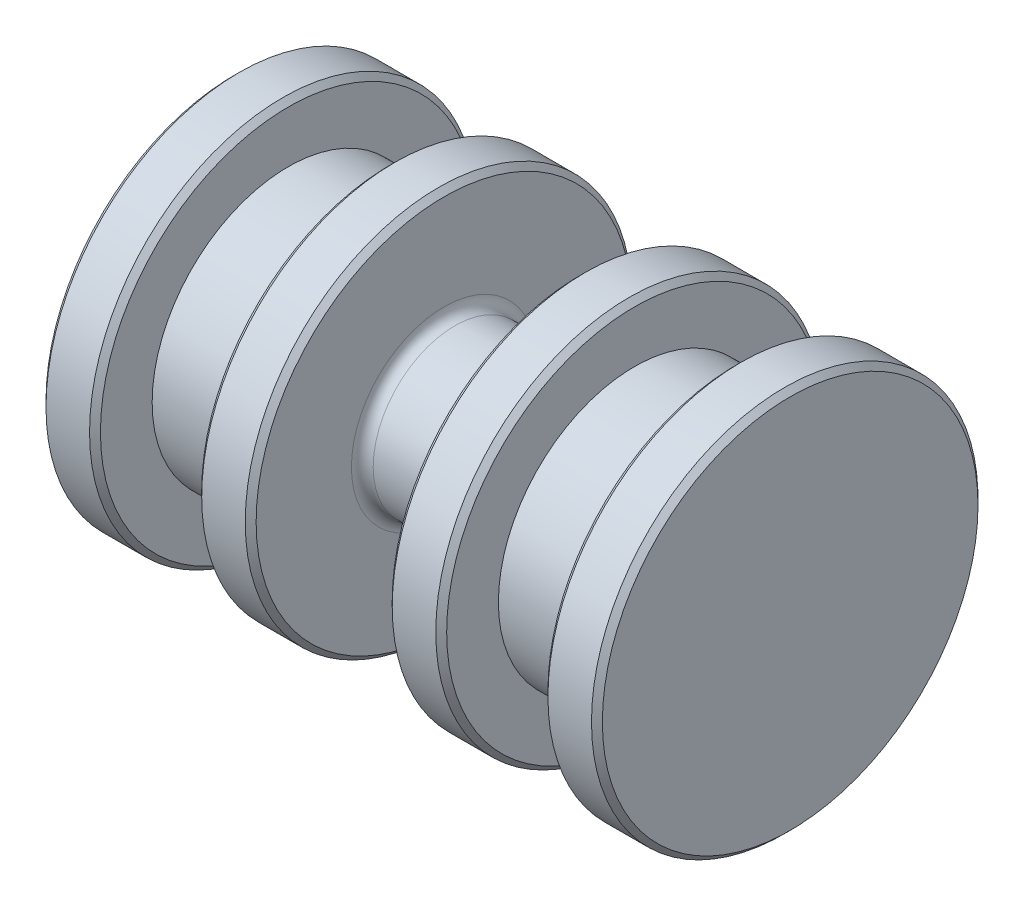
ISO-10303-21;
HEADER;
FILE_DESCRIPTION(('STEP AP214'),'2;1');
FILE_NAME('part.step','',(''),(''),'','','');
FILE_SCHEMA(('AUTOMOTIVE_DESIGN { 1 0 10303 214 1 1 1 1 }'));
ENDSEC;
DATA;
#1=APPLICATION_CONTEXT('core data for automotive mechanical design processes');
#2=APPLICATION_PROTOCOL_DEFINITION('international standard','automotive_design',2000,#1);
#3=PRODUCT_CONTEXT('',#1,'mechanical');
#4=PRODUCT('Part','Part','',(#3));
#5=PRODUCT_RELATED_PRODUCT_CATEGORY('part','',(#4));
#6=PRODUCT_DEFINITION_FORMATION('','',#4);
#7=PRODUCT_DEFINITION_CONTEXT('part definition',#1,'design');
#8=PRODUCT_DEFINITION('design','',#6,#7);
#9=PRODUCT_DEFINITION_SHAPE('','',#8);
#10=(LENGTH_UNIT() NAMED_UNIT(*) SI_UNIT(.MILLI.,.METRE.));
#11=(NAMED_UNIT(*) PLANE_ANGLE_UNIT() SI_UNIT($,.RADIAN.));
#12=(NAMED_UNIT(*) SI_UNIT($,.STERADIAN.) SOLID_ANGLE_UNIT());
#13=UNCERTAINTY_MEASURE_WITH_UNIT(LENGTH_MEASURE(1.E-05),#10,'distance_accuracy_value','');
#14=(GEOMETRIC_REPRESENTATION_CONTEXT(3) GLOBAL_UNCERTAINTY_ASSIGNED_CONTEXT((#13)) GLOBAL_UNIT_ASSIGNED_CONTEXT((#10,
#11,#12)) REPRESENTATION_CONTEXT('',''));
#15=CARTESIAN_POINT('',(0.,0.,0.));
#16=DIRECTION('',(0.,0.,1.));
#17=DIRECTION('',(1.,0.,0.));
#18=AXIS2_PLACEMENT_3D('',#15,#16,#17);
#19=CARTESIAN_POINT('',(-1.61741962375833,0.,0.));
#20=DIRECTION('',(-1.,0.,0.));
#21=DIRECTION('',(0.,0.,1.));
#22=AXIS2_PLACEMENT_3D('',#19,#20,#21);
#23=CYLINDRICAL_SURFACE('',#22,4.5085);
#24=CARTESIAN_POINT('',(1.143,0.,0.));
#25=DIRECTION('',(-1.,0.,0.));
#26=DIRECTION('',(0.,0.,1.));
#27=AXIS2_PLACEMENT_3D('',#24,#25,#26);
#28=CIRCLE('',#27,4.5085);
#29=CARTESIAN_POINT('',(1.143,0.,4.5085));
#30=VERTEX_POINT('',#29);
#31=EDGE_CURVE('E71',#30,#30,#28,.T.);
#32=ORIENTED_EDGE('',*,*,#31,.T.);
#33=EDGE_LOOP('',(#32));
#34=FACE_BOUND('',#33,.T.);
#35=CARTESIAN_POINT('',(0.126999999999998,0.,0.));
#36=DIRECTION('',(1.,0.,0.));
#37=DIRECTION('',(0.,0.,-1.));
#38=AXIS2_PLACEMENT_3D('',#35,#36,#37);
#39=CIRCLE('',#38,4.5085);
#40=CARTESIAN_POINT('',(0.126999999999998,0.,-4.5085));
#41=VERTEX_POINT('',#40);
#42=EDGE_CURVE('E75',#41,#41,#39,.T.);
#43=ORIENTED_EDGE('',*,*,#42,.T.);
#44=EDGE_LOOP('',(#43));
#45=FACE_BOUND('',#44,.T.);
#46=ADVANCED_FACE('F39',(#34,#45),#23,.T.);
#47=CARTESIAN_POINT('',(0.,0.,0.));
#48=DIRECTION('',(1.,0.,0.));
#49=DIRECTION('',(0.,0.,-1.));
#50=AXIS2_PLACEMENT_3D('',#47,#48,#49);
#51=PLANE('',#50);
#52=CARTESIAN_POINT('',(0.,0.,0.));
#53=DIRECTION('',(1.,0.,0.));
#54=DIRECTION('',(0.,0.,-1.));
#55=AXIS2_PLACEMENT_3D('',#52,#53,#54);
#56=CIRCLE('',#55,4.3815);
#57=CARTESIAN_POINT('',(0.,0.,-4.3815));
#58=VERTEX_POINT('',#57);
#59=EDGE_CURVE('E63',#58,#58,#56,.F.);
#60=ORIENTED_EDGE('',*,*,#59,.T.);
#61=EDGE_LOOP('',(#60));
#62=FACE_BOUND('',#61,.T.);
#63=ADVANCED_FACE('F164',(#62),#51,.F.);
#64=CARTESIAN_POINT('',(12.9794,4.5085,0.));
#65=DIRECTION('',(-1.,0.,0.));
#66=DIRECTION('',(0.,0.,1.));
#67=AXIS2_PLACEMENT_3D('',#64,#65,#66);
#68=PLANE('',#67);
#69=CARTESIAN_POINT('',(12.9794,0.,0.));
#70=DIRECTION('',(-1.,0.,0.));
#71=DIRECTION('',(0.,0.,1.));
#72=AXIS2_PLACEMENT_3D('',#69,#70,#71);
#73=CIRCLE('',#72,4.3815);
#74=CARTESIAN_POINT('',(12.9794,0.,4.3815));
#75=VERTEX_POINT('',#74);
#76=EDGE_CURVE('E111',#75,#75,#73,.F.);
#77=ORIENTED_EDGE('',*,*,#76,.T.);
#78=EDGE_LOOP('',(#77));
#79=FACE_BOUND('',#78,.T.);
#80=ADVANCED_FACE('F170',(#79),#68,.F.);
#81=CARTESIAN_POINT('',(-1.61741962375833,0.,0.));
#82=DIRECTION('',(-1.,0.,0.));
#83=DIRECTION('',(0.,0.,1.));
#84=AXIS2_PLACEMENT_3D('',#81,#82,#83);
#85=CYLINDRICAL_SURFACE('',#84,4.5085);
#86=CARTESIAN_POINT('',(11.8364,0.,0.));
#87=DIRECTION('',(1.,0.,0.));
#88=DIRECTION('',(0.,0.,-1.));
#89=AXIS2_PLACEMENT_3D('',#86,#87,#88);
#90=CIRCLE('',#89,4.5085);
#91=CARTESIAN_POINT('',(11.8364,0.,-4.5085));
#92=VERTEX_POINT('',#91);
#93=EDGE_CURVE('E115',#92,#92,#90,.T.);
#94=ORIENTED_EDGE('',*,*,#93,.T.);
#95=EDGE_LOOP('',(#94));
#96=FACE_BOUND('',#95,.T.);
#97=CARTESIAN_POINT('',(12.8524,0.,0.));
#98=DIRECTION('',(-1.,0.,0.));
#99=DIRECTION('',(0.,0.,1.));
#100=AXIS2_PLACEMENT_3D('',#97,#98,#99);
#101=CIRCLE('',#100,4.5085);
#102=CARTESIAN_POINT('',(12.8524,0.,4.5085));
#103=VERTEX_POINT('',#102);
#104=EDGE_CURVE('E119',#103,#103,#101,.T.);
#105=ORIENTED_EDGE('',*,*,#104,.T.);
#106=EDGE_LOOP('',(#105));
#107=FACE_BOUND('',#106,.T.);
#108=ADVANCED_FACE('F270',(#96,#107),#85,.T.);
#109=CARTESIAN_POINT('',(11.7094,4.5085,0.));
#110=DIRECTION('',(1.,0.,0.));
#111=DIRECTION('',(0.,0.,-1.));
#112=AXIS2_PLACEMENT_3D('',#109,#110,#111);
#113=PLANE('',#112);
#114=CARTESIAN_POINT('',(11.7094,0.,0.));
#115=DIRECTION('',(1.,0.,0.));
#116=DIRECTION('',(0.,0.,-1.));
#117=AXIS2_PLACEMENT_3D('',#114,#115,#116);
#118=CIRCLE('',#117,4.3815);
#119=CARTESIAN_POINT('',(11.7094,0.,-4.3815));
#120=VERTEX_POINT('',#119);
#121=EDGE_CURVE('E123',#120,#120,#118,.F.);
#122=ORIENTED_EDGE('',*,*,#121,.T.);
#123=EDGE_LOOP('',(#122));
#124=FACE_BOUND('',#123,.T.);
#125=CARTESIAN_POINT('',(11.7094,0.,0.));
#126=DIRECTION('',(-1.,0.,0.));
#127=DIRECTION('',(0.,0.,1.));
#128=AXIS2_PLACEMENT_3D('',#125,#126,#127);
#129=CIRCLE('',#128,3.175);
#130=CARTESIAN_POINT('',(11.7094,0.,3.175));
#131=VERTEX_POINT('',#130);
#132=EDGE_CURVE('E127',#131,#131,#129,.T.);
#133=ORIENTED_EDGE('',*,*,#132,.F.);
#134=EDGE_LOOP('',(#133));
#135=FACE_BOUND('',#134,.T.);
#136=ADVANCED_FACE('F266',(#124,#135),#113,.F.);
#137=CARTESIAN_POINT('',(-1.61741962375833,0.,0.));
#138=DIRECTION('',(-1.,0.,0.));
#139=DIRECTION('',(0.,0.,1.));
#140=AXIS2_PLACEMENT_3D('',#137,#138,#139);
#141=CYLINDRICAL_SURFACE('',#140,3.175);
#142=CARTESIAN_POINT('',(9.3472,0.,0.));
#143=DIRECTION('',(-1.,0.,0.));
#144=DIRECTION('',(0.,0.,1.));
#145=AXIS2_PLACEMENT_3D('',#142,#143,#144);
#146=CIRCLE('',#145,3.175);
#147=CARTESIAN_POINT('',(9.3472,0.,3.175));
#148=VERTEX_POINT('',#147);
#149=EDGE_CURVE('E131',#148,#148,#146,.T.);
#150=ORIENTED_EDGE('',*,*,#149,.F.);
#151=EDGE_LOOP('',(#150));
#152=FACE_BOUND('',#151,.T.);
#153=ORIENTED_EDGE('',*,*,#132,.T.);
#154=EDGE_LOOP('',(#153));
#155=FACE_BOUND('',#154,.T.);
#156=ADVANCED_FACE('F262',(#152,#155),#141,.T.);
#157=CARTESIAN_POINT('',(9.3472,3.175,0.));
#158=DIRECTION('',(-1.,0.,0.));
#159=DIRECTION('',(0.,0.,1.));
#160=AXIS2_PLACEMENT_3D('',#157,#158,#159);
#161=PLANE('',#160);
#162=CARTESIAN_POINT('',(9.3472,0.,0.));
#163=DIRECTION('',(-1.,0.,0.));
#164=DIRECTION('',(0.,0.,1.));
#165=AXIS2_PLACEMENT_3D('',#162,#163,#164);
#166=CIRCLE('',#165,4.3815);
#167=CARTESIAN_POINT('',(9.3472,0.,4.3815));
#168=VERTEX_POINT('',#167);
#169=EDGE_CURVE('E99',#168,#168,#166,.F.);
#170=ORIENTED_EDGE('',*,*,#169,.T.);
#171=EDGE_LOOP('',(#170));
#172=FACE_BOUND('',#171,.T.);
#173=ORIENTED_EDGE('',*,*,#149,.T.);
#174=EDGE_LOOP('',(#173));
#175=FACE_BOUND('',#174,.T.);
#176=ADVANCED_FACE('F258',(#172,#175),#161,.F.);
#177=CARTESIAN_POINT('',(-1.61741962375833,0.,0.));
#178=DIRECTION('',(-1.,0.,0.));
#179=DIRECTION('',(0.,0.,1.));
#180=AXIS2_PLACEMENT_3D('',#177,#178,#179);
#181=CYLINDRICAL_SURFACE('',#180,4.5085);
#182=CARTESIAN_POINT('',(9.2202,0.,0.));
#183=DIRECTION('',(-1.,0.,0.));
#184=DIRECTION('',(0.,0.,1.));
#185=AXIS2_PLACEMENT_3D('',#182,#183,#184);
#186=CIRCLE('',#185,4.5085);
#187=CARTESIAN_POINT('',(9.2202,0.,4.5085));
#188=VERTEX_POINT('',#187);
#189=EDGE_CURVE('E103',#188,#188,#186,.T.);
#190=ORIENTED_EDGE('',*,*,#189,.T.);
#191=EDGE_LOOP('',(#190));
#192=FACE_BOUND('',#191,.T.);
#193=CARTESIAN_POINT('',(8.2042,0.,0.));
#194=DIRECTION('',(1.,0.,0.));
#195=DIRECTION('',(0.,0.,-1.));
#196=AXIS2_PLACEMENT_3D('',#193,#194,#195);
#197=CIRCLE('',#196,4.5085);
#198=CARTESIAN_POINT('',(8.2042,0.,-4.5085));
#199=VERTEX_POINT('',#198);
#200=EDGE_CURVE('E107',#199,#199,#197,.T.);
#201=ORIENTED_EDGE('',*,*,#200,.T.);
#202=EDGE_LOOP('',(#201));
#203=FACE_BOUND('',#202,.T.);
#204=ADVANCED_FACE('F253',(#192,#203),#181,.T.);
#205=CARTESIAN_POINT('',(8.0772,4.5085,0.));
#206=DIRECTION('',(1.,0.,0.));
#207=DIRECTION('',(0.,0.,-1.));
#208=AXIS2_PLACEMENT_3D('',#205,#206,#207);
#209=PLANE('',#208);
#210=CARTESIAN_POINT('',(8.0772,0.,0.));
#211=DIRECTION('',(1.,0.,0.));
#212=DIRECTION('',(0.,0.,-1.));
#213=AXIS2_PLACEMENT_3D('',#210,#211,#212);
#214=CIRCLE('',#213,2.159);
#215=CARTESIAN_POINT('',(8.0772,0.,-2.159));
#216=VERTEX_POINT('',#215);
#217=EDGE_CURVE('E47',#216,#216,#214,.T.);
#218=ORIENTED_EDGE('',*,*,#217,.T.);
#219=EDGE_LOOP('',(#218));
#220=FACE_BOUND('',#219,.T.);
#221=CARTESIAN_POINT('',(8.0772,0.,0.));
#222=DIRECTION('',(1.,0.,0.));
#223=DIRECTION('',(0.,0.,-1.));
#224=AXIS2_PLACEMENT_3D('',#221,#222,#223);
#225=CIRCLE('',#224,4.3815);
#226=CARTESIAN_POINT('',(8.0772,0.,-4.3815));
#227=VERTEX_POINT('',#226);
#228=EDGE_CURVE('E95',#227,#227,#225,.F.);
#229=ORIENTED_EDGE('',*,*,#228,.T.);
#230=EDGE_LOOP('',(#229));
#231=FACE_BOUND('',#230,.T.);
#232=ADVANCED_FACE('F244',(#220,#231),#209,.F.);
#233=CARTESIAN_POINT('',(-1.61741962375833,0.,0.));
#234=DIRECTION('',(-1.,0.,0.));
#235=DIRECTION('',(0.,0.,1.));
#236=AXIS2_PLACEMENT_3D('',#233,#234,#235);
#237=CYLINDRICAL_SURFACE('',#236,1.905);
#238=CARTESIAN_POINT('',(7.8232,0.,0.));
#239=DIRECTION('',(1.,0.,0.));
#240=DIRECTION('',(0.,0.,-1.));
#241=AXIS2_PLACEMENT_3D('',#238,#239,#240);
#242=CIRCLE('',#241,1.905);
#243=CARTESIAN_POINT('',(7.8232,0.,-1.905));
#244=VERTEX_POINT('',#243);
#245=EDGE_CURVE('E52',#244,#244,#242,.F.);
#246=ORIENTED_EDGE('',*,*,#245,.T.);
#247=EDGE_LOOP('',(#246));
#248=FACE_BOUND('',#247,.T.);
#249=CARTESIAN_POINT('',(5.1562,0.,0.));
#250=DIRECTION('',(-1.,0.,0.));
#251=DIRECTION('',(0.,0.,1.));
#252=AXIS2_PLACEMENT_3D('',#249,#250,#251);
#253=CIRCLE('',#252,1.905);
#254=CARTESIAN_POINT('',(5.1562,0.,1.905));
#255=VERTEX_POINT('',#254);
#256=EDGE_CURVE('E57',#255,#255,#253,.F.);
#257=ORIENTED_EDGE('',*,*,#256,.T.);
#258=EDGE_LOOP('',(#257));
#259=FACE_BOUND('',#258,.T.);
#260=ADVANCED_FACE('F241',(#248,#259),#237,.T.);
#261=CARTESIAN_POINT('',(4.9022,4.5085,0.));
#262=DIRECTION('',(-1.,0.,0.));
#263=DIRECTION('',(0.,0.,1.));
#264=AXIS2_PLACEMENT_3D('',#261,#262,#263);
#265=PLANE('',#264);
#266=CARTESIAN_POINT('',(4.9022,0.,0.));
#267=DIRECTION('',(-1.,0.,0.));
#268=DIRECTION('',(0.,0.,1.));
#269=AXIS2_PLACEMENT_3D('',#266,#267,#268);
#270=CIRCLE('',#269,2.159);
#271=CARTESIAN_POINT('',(4.9022,0.,2.159));
#272=VERTEX_POINT('',#271);
#273=EDGE_CURVE('E10',#272,#272,#270,.T.);
#274=ORIENTED_EDGE('',*,*,#273,.T.);
#275=EDGE_LOOP('',(#274));
#276=FACE_BOUND('',#275,.T.);
#277=CARTESIAN_POINT('',(4.9022,0.,0.));
#278=DIRECTION('',(-1.,0.,0.));
#279=DIRECTION('',(0.,0.,1.));
#280=AXIS2_PLACEMENT_3D('',#277,#278,#279);
#281=CIRCLE('',#280,4.3815);
#282=CARTESIAN_POINT('',(4.9022,0.,4.3815));
#283=VERTEX_POINT('',#282);
#284=EDGE_CURVE('E83',#283,#283,#281,.F.);
#285=ORIENTED_EDGE('',*,*,#284,.T.);
#286=EDGE_LOOP('',(#285));
#287=FACE_BOUND('',#286,.T.);
#288=ADVANCED_FACE('F160',(#276,#287),#265,.F.);
#289=CARTESIAN_POINT('',(-1.61741962375833,0.,0.));
#290=DIRECTION('',(-1.,0.,0.));
#291=DIRECTION('',(0.,0.,1.));
#292=AXIS2_PLACEMENT_3D('',#289,#290,#291);
#293=CYLINDRICAL_SURFACE('',#292,4.5085);
#294=CARTESIAN_POINT('',(4.7752,0.,0.));
#295=DIRECTION('',(-1.,0.,0.));
#296=DIRECTION('',(0.,0.,1.));
#297=AXIS2_PLACEMENT_3D('',#294,#295,#296);
#298=CIRCLE('',#297,4.5085);
#299=CARTESIAN_POINT('',(4.7752,0.,4.5085));
#300=VERTEX_POINT('',#299);
#301=EDGE_CURVE('E87',#300,#300,#298,.T.);
#302=ORIENTED_EDGE('',*,*,#301,.T.);
#303=EDGE_LOOP('',(#302));
#304=FACE_BOUND('',#303,.T.);
#305=CARTESIAN_POINT('',(3.75920000000001,0.,0.));
#306=DIRECTION('',(1.,0.,0.));
#307=DIRECTION('',(0.,0.,-1.));
#308=AXIS2_PLACEMENT_3D('',#305,#306,#307);
#309=CIRCLE('',#308,4.5085);
#310=CARTESIAN_POINT('',(3.75920000000001,0.,-4.5085));
#311=VERTEX_POINT('',#310);
#312=EDGE_CURVE('E91',#311,#311,#309,.T.);
#313=ORIENTED_EDGE('',*,*,#312,.T.);
#314=EDGE_LOOP('',(#313));
#315=FACE_BOUND('',#314,.T.);
#316=ADVANCED_FACE('F154',(#304,#315),#293,.T.);
#317=CARTESIAN_POINT('',(3.6322,4.5085,0.));
#318=DIRECTION('',(1.,0.,0.));
#319=DIRECTION('',(0.,0.,-1.));
#320=AXIS2_PLACEMENT_3D('',#317,#318,#319);
#321=PLANE('',#320);
#322=CARTESIAN_POINT('',(3.6322,0.,0.));
#323=DIRECTION('',(1.,0.,0.));
#324=DIRECTION('',(0.,0.,-1.));
#325=AXIS2_PLACEMENT_3D('',#322,#323,#324);
#326=CIRCLE('',#325,4.3815);
#327=CARTESIAN_POINT('',(3.6322,0.,-4.3815));
#328=VERTEX_POINT('',#327);
#329=EDGE_CURVE('E79',#328,#328,#326,.F.);
#330=ORIENTED_EDGE('',*,*,#329,.T.);
#331=EDGE_LOOP('',(#330));
#332=FACE_BOUND('',#331,.T.);
#333=CARTESIAN_POINT('',(3.6322,0.,0.));
#334=DIRECTION('',(-1.,0.,0.));
#335=DIRECTION('',(0.,0.,1.));
#336=AXIS2_PLACEMENT_3D('',#333,#334,#335);
#337=CIRCLE('',#336,3.175);
#338=CARTESIAN_POINT('',(3.6322,0.,3.175));
#339=VERTEX_POINT('',#338);
#340=EDGE_CURVE('E135',#339,#339,#337,.T.);
#341=ORIENTED_EDGE('',*,*,#340,.F.);
#342=EDGE_LOOP('',(#341));
#343=FACE_BOUND('',#342,.T.);
#344=ADVANCED_FACE('F149',(#332,#343),#321,.F.);
#345=CARTESIAN_POINT('',(-1.61741962375833,0.,0.));
#346=DIRECTION('',(-1.,0.,0.));
#347=DIRECTION('',(0.,0.,1.));
#348=AXIS2_PLACEMENT_3D('',#345,#346,#347);
#349=CYLINDRICAL_SURFACE('',#348,3.175);
#350=CARTESIAN_POINT('',(1.27,0.,0.));
#351=DIRECTION('',(-1.,0.,0.));
#352=DIRECTION('',(0.,0.,1.));
#353=AXIS2_PLACEMENT_3D('',#350,#351,#352);
#354=CIRCLE('',#353,3.175);
#355=CARTESIAN_POINT('',(1.27,0.,3.175));
#356=VERTEX_POINT('',#355);
#357=EDGE_CURVE('E139',#356,#356,#354,.T.);
#358=ORIENTED_EDGE('',*,*,#357,.F.);
#359=EDGE_LOOP('',(#358));
#360=FACE_BOUND('',#359,.T.);
#361=ORIENTED_EDGE('',*,*,#340,.T.);
#362=EDGE_LOOP('',(#361));
#363=FACE_BOUND('',#362,.T.);
#364=ADVANCED_FACE('F146',(#360,#363),#349,.T.);
#365=CARTESIAN_POINT('',(1.27,3.175,0.));
#366=DIRECTION('',(-1.,0.,0.));
#367=DIRECTION('',(0.,0.,1.));
#368=AXIS2_PLACEMENT_3D('',#365,#366,#367);
#369=PLANE('',#368);
#370=CARTESIAN_POINT('',(1.27,0.,0.));
#371=DIRECTION('',(-1.,0.,0.));
#372=DIRECTION('',(0.,0.,1.));
#373=AXIS2_PLACEMENT_3D('',#370,#371,#372);
#374=CIRCLE('',#373,4.3815);
#375=CARTESIAN_POINT('',(1.27,0.,4.3815));
#376=VERTEX_POINT('',#375);
#377=EDGE_CURVE('E67',#376,#376,#374,.F.);
#378=ORIENTED_EDGE('',*,*,#377,.T.);
#379=EDGE_LOOP('',(#378));
#380=FACE_BOUND('',#379,.T.);
#381=ORIENTED_EDGE('',*,*,#357,.T.);
#382=EDGE_LOOP('',(#381));
#383=FACE_BOUND('',#382,.T.);
#384=ADVANCED_FACE('F144',(#380,#383),#369,.F.);
#385=CARTESIAN_POINT('',(11.7094,0.,0.));
#386=DIRECTION('',(1.,0.,0.));
#387=DIRECTION('',(0.,0.,-1.));
#388=AXIS2_PLACEMENT_3D('',#385,#386,#387);
#389=CONICAL_SURFACE('',#388,4.3815,0.785398163397442);
#390=ORIENTED_EDGE('',*,*,#93,.F.);
#391=EDGE_LOOP('',(#390));
#392=FACE_BOUND('',#391,.T.);
#393=ORIENTED_EDGE('',*,*,#121,.F.);
#394=EDGE_LOOP('',(#393));
#395=FACE_BOUND('',#394,.T.);
#396=ADVANCED_FACE('F177',(#392,#395),#389,.T.);
#397=CARTESIAN_POINT('',(12.8524,0.,0.));
#398=DIRECTION('',(-1.,0.,0.));
#399=DIRECTION('',(0.,0.,1.));
#400=AXIS2_PLACEMENT_3D('',#397,#398,#399);
#401=CONICAL_SURFACE('',#400,4.5085,0.785398163397442);
#402=ORIENTED_EDGE('',*,*,#76,.F.);
#403=EDGE_LOOP('',(#402));
#404=FACE_BOUND('',#403,.T.);
#405=ORIENTED_EDGE('',*,*,#104,.F.);
#406=EDGE_LOOP('',(#405));
#407=FACE_BOUND('',#406,.T.);
#408=ADVANCED_FACE('F183',(#404,#407),#401,.T.);
#409=CARTESIAN_POINT('',(9.2202,0.,0.));
#410=DIRECTION('',(-1.,0.,0.));
#411=DIRECTION('',(0.,0.,1.));
#412=AXIS2_PLACEMENT_3D('',#409,#410,#411);
#413=CONICAL_SURFACE('',#412,4.5085,0.785398163397448);
#414=ORIENTED_EDGE('',*,*,#169,.F.);
#415=EDGE_LOOP('',(#414));
#416=FACE_BOUND('',#415,.T.);
#417=ORIENTED_EDGE('',*,*,#189,.F.);
#418=EDGE_LOOP('',(#417));
#419=FACE_BOUND('',#418,.T.);
#420=ADVANCED_FACE('F190',(#416,#419),#413,.T.);
#421=CARTESIAN_POINT('',(8.0772,0.,0.));
#422=DIRECTION('',(1.,0.,0.));
#423=DIRECTION('',(0.,0.,-1.));
#424=AXIS2_PLACEMENT_3D('',#421,#422,#423);
#425=CONICAL_SURFACE('',#424,4.3815,0.785398163397442);
#426=ORIENTED_EDGE('',*,*,#200,.F.);
#427=EDGE_LOOP('',(#426));
#428=FACE_BOUND('',#427,.T.);
#429=ORIENTED_EDGE('',*,*,#228,.F.);
#430=EDGE_LOOP('',(#429));
#431=FACE_BOUND('',#430,.T.);
#432=ADVANCED_FACE('F197',(#428,#431),#425,.T.);
#433=CARTESIAN_POINT('',(4.7752,0.,0.));
#434=DIRECTION('',(-1.,0.,0.));
#435=DIRECTION('',(0.,0.,1.));
#436=AXIS2_PLACEMENT_3D('',#433,#434,#435);
#437=CONICAL_SURFACE('',#436,4.5085,0.785398163397455);
#438=ORIENTED_EDGE('',*,*,#284,.F.);
#439=EDGE_LOOP('',(#438));
#440=FACE_BOUND('',#439,.T.);
#441=ORIENTED_EDGE('',*,*,#301,.F.);
#442=EDGE_LOOP('',(#441));
#443=FACE_BOUND('',#442,.T.);
#444=ADVANCED_FACE('F204',(#440,#443),#437,.T.);
#445=CARTESIAN_POINT('',(3.6322,0.,0.));
#446=DIRECTION('',(1.,0.,0.));
#447=DIRECTION('',(0.,0.,-1.));
#448=AXIS2_PLACEMENT_3D('',#445,#446,#447);
#449=CONICAL_SURFACE('',#448,4.3815,0.785398163397442);
#450=ORIENTED_EDGE('',*,*,#312,.F.);
#451=EDGE_LOOP('',(#450));
#452=FACE_BOUND('',#451,.T.);
#453=ORIENTED_EDGE('',*,*,#329,.F.);
#454=EDGE_LOOP('',(#453));
#455=FACE_BOUND('',#454,.T.);
#456=ADVANCED_FACE('F211',(#452,#455),#449,.T.);
#457=CARTESIAN_POINT('',(1.143,0.,0.));
#458=DIRECTION('',(-1.,0.,0.));
#459=DIRECTION('',(0.,0.,1.));
#460=AXIS2_PLACEMENT_3D('',#457,#458,#459);
#461=CONICAL_SURFACE('',#460,4.5085,0.785398163397448);
#462=ORIENTED_EDGE('',*,*,#377,.F.);
#463=EDGE_LOOP('',(#462));
#464=FACE_BOUND('',#463,.T.);
#465=ORIENTED_EDGE('',*,*,#31,.F.);
#466=EDGE_LOOP('',(#465));
#467=FACE_BOUND('',#466,.T.);
#468=ADVANCED_FACE('F218',(#464,#467),#461,.T.);
#469=CARTESIAN_POINT('',(0.,0.,0.));
#470=DIRECTION('',(1.,0.,0.));
#471=DIRECTION('',(0.,0.,-1.));
#472=AXIS2_PLACEMENT_3D('',#469,#470,#471);
#473=CONICAL_SURFACE('',#472,4.3815,0.785398163397442);
#474=ORIENTED_EDGE('',*,*,#42,.F.);
#475=EDGE_LOOP('',(#474));
#476=FACE_BOUND('',#475,.T.);
#477=ORIENTED_EDGE('',*,*,#59,.F.);
#478=EDGE_LOOP('',(#477));
#479=FACE_BOUND('',#478,.T.);
#480=ADVANCED_FACE('F225',(#476,#479),#473,.T.);
#481=CARTESIAN_POINT('',(7.8232,0.,0.));
#482=DIRECTION('',(1.,0.,0.));
#483=DIRECTION('',(0.,0.,-1.));
#484=AXIS2_PLACEMENT_3D('',#481,#482,#483);
#485=TOROIDAL_SURFACE('',#484,2.159,0.254);
#486=ORIENTED_EDGE('',*,*,#217,.F.);
#487=EDGE_LOOP('',(#486));
#488=FACE_BOUND('',#487,.T.);
#489=ORIENTED_EDGE('',*,*,#245,.F.);
#490=EDGE_LOOP('',(#489));
#491=FACE_BOUND('',#490,.T.);
#492=ADVANCED_FACE('F230',(#488,#491),#485,.F.);
#493=CARTESIAN_POINT('',(5.1562,0.,0.));
#494=DIRECTION('',(-1.,0.,0.));
#495=DIRECTION('',(0.,0.,1.));
#496=AXIS2_PLACEMENT_3D('',#493,#494,#495);
#497=TOROIDAL_SURFACE('',#496,2.159,0.254);
#498=ORIENTED_EDGE('',*,*,#256,.F.);
#499=EDGE_LOOP('',(#498));
#500=FACE_BOUND('',#499,.T.);
#501=ORIENTED_EDGE('',*,*,#273,.F.);
#502=EDGE_LOOP('',(#501));
#503=FACE_BOUND('',#502,.T.);
#504=ADVANCED_FACE('F41',(#500,#503),#497,.F.);
#505=CLOSED_SHELL('',(#46,#63,#80,#108,#136,#156,#176,#204,#232,#260,#288,#316,#344,#364,#384,
#396,#408,#420,#432,#444,#456,#468,#480,#492,#504));
#506=MANIFOLD_SOLID_BREP('B2',#505);
#507=ADVANCED_BREP_SHAPE_REPRESENTATION('',(#18,#506),#14);
#508=SHAPE_DEFINITION_REPRESENTATION(#9,#507);
ENDSEC;
END-ISO-10303-21;
